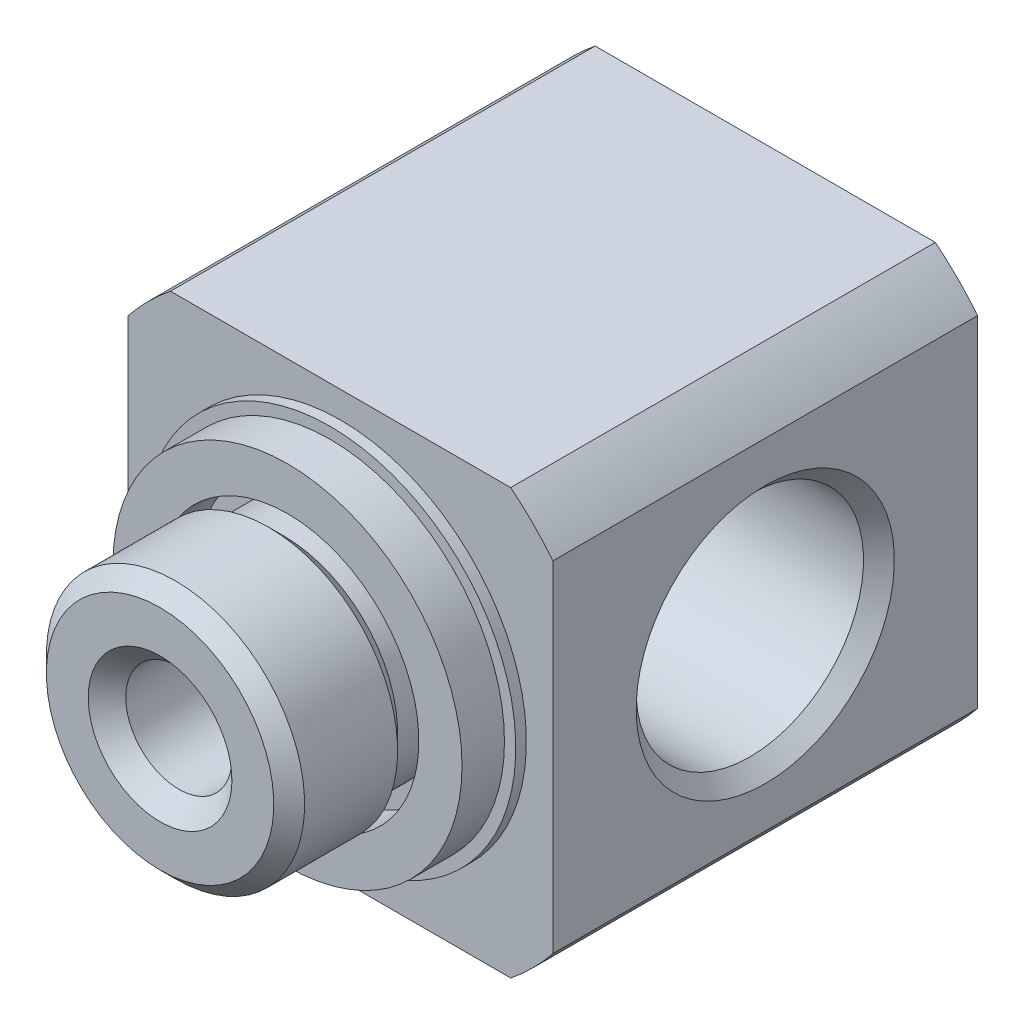
ISO-10303-21;
HEADER;
FILE_DESCRIPTION(('STEP AP214'),'2;1');
FILE_NAME('part.step','',(''),(''),'','','');
FILE_SCHEMA(('AUTOMOTIVE_DESIGN { 1 0 10303 214 1 1 1 1 }'));
ENDSEC;
DATA;
#1=APPLICATION_CONTEXT('core data for automotive mechanical design processes');
#2=APPLICATION_PROTOCOL_DEFINITION('international standard','automotive_design',2000,#1);
#3=PRODUCT_CONTEXT('',#1,'mechanical');
#4=PRODUCT('Part','Part','',(#3));
#5=PRODUCT_RELATED_PRODUCT_CATEGORY('part','',(#4));
#6=PRODUCT_DEFINITION_FORMATION('','',#4);
#7=PRODUCT_DEFINITION_CONTEXT('part definition',#1,'design');
#8=PRODUCT_DEFINITION('design','',#6,#7);
#9=PRODUCT_DEFINITION_SHAPE('','',#8);
#10=(LENGTH_UNIT() NAMED_UNIT(*) SI_UNIT(.MILLI.,.METRE.));
#11=(NAMED_UNIT(*) PLANE_ANGLE_UNIT() SI_UNIT($,.RADIAN.));
#12=(NAMED_UNIT(*) SI_UNIT($,.STERADIAN.) SOLID_ANGLE_UNIT());
#13=UNCERTAINTY_MEASURE_WITH_UNIT(LENGTH_MEASURE(1.E-05),#10,'distance_accuracy_value','');
#14=(GEOMETRIC_REPRESENTATION_CONTEXT(3) GLOBAL_UNCERTAINTY_ASSIGNED_CONTEXT((#13)) GLOBAL_UNIT_ASSIGNED_CONTEXT((#10,
#11,#12)) REPRESENTATION_CONTEXT('',''));
#15=CARTESIAN_POINT('',(0.,0.,0.));
#16=DIRECTION('',(0.,0.,1.));
#17=DIRECTION('',(1.,0.,0.));
#18=AXIS2_PLACEMENT_3D('',#15,#16,#17);
#19=CARTESIAN_POINT('',(0.,0.,14.4464466094065));
#20=DIRECTION('',(0.,0.,1.));
#21=DIRECTION('',(0.,1.,0.));
#22=AXIS2_PLACEMENT_3D('',#19,#20,#21);
#23=CONICAL_SURFACE('',#22,2.35355339059325,0.785398163397094);
#24=CARTESIAN_POINT('',(0.,0.,14.092893218813));
#25=DIRECTION('',(0.,0.,-1.));
#26=DIRECTION('',(0.,1.,0.));
#27=AXIS2_PLACEMENT_3D('',#24,#25,#26);
#28=CIRCLE('',#27,2.);
#29=CARTESIAN_POINT('',(0.,2.,14.092893218813));
#30=VERTEX_POINT('',#29);
#31=EDGE_CURVE('E11',#30,#30,#28,.T.);
#32=ORIENTED_EDGE('',*,*,#31,.T.);
#33=EDGE_LOOP('',(#32));
#34=FACE_BOUND('',#33,.T.);
#35=CARTESIAN_POINT('',(0.,0.,14.8));
#36=DIRECTION('',(0.,0.,-1.));
#37=DIRECTION('',(0.,1.,0.));
#38=AXIS2_PLACEMENT_3D('',#35,#36,#37);
#39=CIRCLE('',#38,2.7071067811865);
#40=CARTESIAN_POINT('',(0.,2.7071067811865,14.8));
#41=VERTEX_POINT('',#40);
#42=EDGE_CURVE('E219',#41,#41,#39,.T.);
#43=ORIENTED_EDGE('',*,*,#42,.F.);
#44=EDGE_LOOP('',(#43));
#45=FACE_BOUND('',#44,.T.);
#46=ADVANCED_FACE('F17',(#34,#45),#23,.F.);
#47=CARTESIAN_POINT('',(0.,0.,7.0464466094065));
#48=DIRECTION('',(0.,0.,1.));
#49=DIRECTION('',(0.,1.,0.));
#50=AXIS2_PLACEMENT_3D('',#47,#48,#49);
#51=CYLINDRICAL_SURFACE('',#50,2.);
#52=CARTESIAN_POINT('',(0.,1.99999999999998,3.7873591062903));
#53=CARTESIAN_POINT('',(-0.0322225855098003,1.99999403364435,3.78736092510232));
#54=CARTESIAN_POINT('',(-0.0644422320749665,1.99917434592477,3.78779508123807));
#55=CARTESIAN_POINT('',(-0.129016025779688,1.99593642093506,3.78950298601541));
#56=CARTESIAN_POINT('',(-0.161369429495311,1.9935065188562,3.79078286106949));
#57=CARTESIAN_POINT('',(-0.226210045204364,1.98704499811597,3.79417367185201));
#58=CARTESIAN_POINT('',(-0.258695177085984,1.98299706415656,3.79629307082892));
#59=CARTESIAN_POINT('',(-0.323800769252444,1.97329680874096,3.80134437764246));
#60=CARTESIAN_POINT('',(-0.356417358594832,1.96762402076201,3.80428663824022));
#61=CARTESIAN_POINT('',(-0.421764370636746,1.9546716523135,3.81095811618483));
#62=CARTESIAN_POINT('',(-0.454489104394777,1.94736915071734,3.81469852237619));
#63=CARTESIAN_POINT('',(-0.519311965820555,1.93122399576629,3.82289738251743));
#64=CARTESIAN_POINT('',(-0.551412204779927,1.92238820274711,3.82735263165357));
#65=CARTESIAN_POINT('',(-0.614986925605875,1.90316636846849,3.83694695949968));
#66=CARTESIAN_POINT('',(-0.646462286051339,1.89278270875671,3.84208498639221));
#67=CARTESIAN_POINT('',(-0.708787224736917,1.87044898439008,3.85300716534164));
#68=CARTESIAN_POINT('',(-0.739635899222135,1.85849682058247,3.85879218171328));
#69=CARTESIAN_POINT('',(-0.800209154483072,1.83323404097384,3.87085718159939));
#70=CARTESIAN_POINT('',(-0.829942922922191,1.81994207183468,3.87713015186951));
#71=CARTESIAN_POINT('',(-0.888918031479625,1.79180501534373,3.89021424641479));
#72=CARTESIAN_POINT('',(-0.918151643008258,1.7769459273923,3.89703006032079));
#73=CARTESIAN_POINT('',(-0.97612746450053,1.74565342387358,3.91114833496912));
#74=CARTESIAN_POINT('',(-1.00485923479123,1.7292029194103,3.91845574309702));
#75=CARTESIAN_POINT('',(-1.06183403248451,1.69470812544723,3.9334987413001));
#76=CARTESIAN_POINT('',(-1.09006388231405,1.67664414264907,3.94123901178485));
#77=CARTESIAN_POINT('',(-1.14447456335615,1.63995822876015,3.95664078756353));
#78=CARTESIAN_POINT('',(-1.17069223458948,1.62138705442172,3.96429318395117));
#79=CARTESIAN_POINT('',(-1.22205917602023,1.58314484193879,3.97971911071421));
#80=CARTESIAN_POINT('',(-1.24721317882251,1.56347984100633,3.98749183277592));
#81=CARTESIAN_POINT('',(-1.29645323034605,1.52303896086674,4.00311250545927));
#82=CARTESIAN_POINT('',(-1.32054227076988,1.50226661035633,4.0109601585475));
#83=CARTESIAN_POINT('',(-1.36765546993925,1.45960217598261,4.02668186464589));
#84=CARTESIAN_POINT('',(-1.39068060039993,1.43771115394691,4.03455588622783));
#85=CARTESIAN_POINT('',(-1.43550789962862,1.3929527439227,4.05022598572905));
#86=CARTESIAN_POINT('',(-1.45731636952698,1.37009173278672,4.05802225108173));
#87=CARTESIAN_POINT('',(-1.49991400772751,1.32321281945393,4.07354995859606));
#88=CARTESIAN_POINT('',(-1.52069799415807,1.29919005479179,4.08128093405954));
#89=CARTESIAN_POINT('',(-1.56124987147542,1.24998025893602,4.09662140948093));
#90=CARTESIAN_POINT('',(-1.58101009575827,1.22478655396121,4.10422976140092));
#91=CARTESIAN_POINT('',(-1.61951757329443,1.17322865771359,4.11926579069395));
#92=CARTESIAN_POINT('',(-1.63825467573696,1.14685627569474,4.12669135666509));
#93=CARTESIAN_POINT('',(-1.675099923307,1.09236234571076,4.14145576126441));
#94=CARTESIAN_POINT('',(-1.69316938449214,1.06421185409779,4.14878441414128));
#95=CARTESIAN_POINT('',(-1.72774321142416,1.00729821202314,4.16296643387457));
#96=CARTESIAN_POINT('',(-1.74426281513489,0.978545428339325,4.16982419806542));
#97=CARTESIAN_POINT('',(-1.77573959196767,0.920435902697168,4.18303315614326));
#98=CARTESIAN_POINT('',(-1.79070965147881,0.891087070206717,4.18938840289748));
#99=CARTESIAN_POINT('',(-1.81909125224259,0.831795185189944,4.20156105345401));
#100=CARTESIAN_POINT('',(-1.83251290900633,0.801857685236834,4.20738189058738));
#101=CARTESIAN_POINT('',(-1.85792153494963,0.741091930635584,4.21851049590289));
#102=CARTESIAN_POINT('',(-1.86990043203856,0.710259762874307,4.22381534805687));
#103=CARTESIAN_POINT('',(-1.89231842284073,0.647900355639973,4.23382954245299));
#104=CARTESIAN_POINT('',(-1.90275553562844,0.616372280777481,4.23853811749323));
#105=CARTESIAN_POINT('',(-1.92209553498119,0.552633092126617,4.24731967367976));
#106=CARTESIAN_POINT('',(-1.93099263515207,0.520419891973284,4.25139025245034));
#107=CARTESIAN_POINT('',(-1.94725578605456,0.455323152085297,4.25885542849658));
#108=CARTESIAN_POINT('',(-1.95461226776269,0.422436739220042,4.26224579571278));
#109=CARTESIAN_POINT('',(-1.96760857689001,0.356964873072775,4.26822251431359));
#110=CARTESIAN_POINT('',(-1.97328069399219,0.324387211834634,4.27082401243525));
#111=CARTESIAN_POINT('',(-1.98298897907824,0.259294485557998,4.27526701224005));
#112=CARTESIAN_POINT('',(-1.98704200350635,0.226782481054934,4.27711634859265));
#113=CARTESIAN_POINT('',(-1.99351484126871,0.161840424273486,4.28006357904881));
#114=CARTESIAN_POINT('',(-1.99594819242668,0.129412008890235,4.28116770302883));
#115=CARTESIAN_POINT('',(-1.99918562131711,0.0646553366082341,4.28263366699753));
#116=CARTESIAN_POINT('',(-1.99999956084848,0.032327677951142,4.28300000011079));
#117=CARTESIAN_POINT('',(-2.00000043898965,-0.0323157615863603,4.28299999988925));
#118=CARTESIAN_POINT('',(-1.99918797722065,-0.0646315424525492,4.28263393657418));
#119=CARTESIAN_POINT('',(-1.9959525190497,-0.129372404928959,4.28116887009348));
#120=CARTESIAN_POINT('',(-1.99351925817674,-0.161796864247999,4.28006519550878));
#121=CARTESIAN_POINT('',(-1.98704622989354,-0.226738936148108,4.277118687808));
#122=CARTESIAN_POINT('',(-1.98299253679569,-0.259254864586438,4.2752694462155));
#123=CARTESIAN_POINT('',(-1.97328304944997,-0.324363491184723,4.27082590465863));
#124=CARTESIAN_POINT('',(-1.96761003621734,-0.356953062817656,4.26822359259921));
#125=CARTESIAN_POINT('',(-1.95461550403955,-0.42242498496107,4.2622468685534));
#126=CARTESIAN_POINT('',(-1.94726280978687,-0.455299813814699,4.25885783256481));
#127=CARTESIAN_POINT('',(-1.93100470659119,-0.52038118468091,4.2513949618118));
#128=CARTESIAN_POINT('',(-1.92210849157274,-0.552590486439022,4.2473251867325));
#129=CARTESIAN_POINT('',(-1.90276830678654,-0.616329715053992,4.2385443370479));
#130=CARTESIAN_POINT('',(-1.89232974084554,-0.647861590480797,4.23383550597249));
#131=CARTESIAN_POINT('',(-1.86990745179457,-0.710236638346927,4.22381932275126));
#132=CARTESIAN_POINT('',(-1.85792533090775,-0.741080486553632,4.21851259193683));
#133=CARTESIAN_POINT('',(-1.83251842418582,-0.801846847023643,4.20738387532119));
#134=CARTESIAN_POINT('',(-1.81910281842554,-0.831773809023054,4.20156520593448));
#135=CARTESIAN_POINT('',(-1.79072927970253,-0.891051747406256,4.18939589220458));
#136=CARTESIAN_POINT('',(-1.7757608671432,-0.920396972698579,4.1830416959296));
#137=CARTESIAN_POINT('',(-1.74428392255959,-0.978506548801328,4.16983334775935));
#138=CARTESIAN_POINT('',(-1.72776216202652,-1.00726277972039,4.16297503537646));
#139=CARTESIAN_POINT('',(-1.69318094597919,-1.06419077924158,4.14878989579861));
#140=CARTESIAN_POINT('',(-1.67510593904516,-1.09235196645704,4.14145857349148));
#141=CARTESIAN_POINT('',(-1.63826190768291,-1.14684701518527,4.12669386557365));
#142=CARTESIAN_POINT('',(-1.61953246218594,-1.17321048780317,4.11927090254762));
#143=CARTESIAN_POINT('',(-1.58103518155665,-1.22475660861311,4.10423867987357));
#144=CARTESIAN_POINT('',(-1.56127721882889,-1.24994722133677,4.09663146948472));
#145=CARTESIAN_POINT('',(-1.52072520295743,-1.29915704783405,4.08129146067596));
#146=CARTESIAN_POINT('',(-1.49993853360974,-1.32318268948843,4.07355976785129));
#147=CARTESIAN_POINT('',(-1.45733125731623,-1.37007386642935,4.05802833873308));
#148=CARTESIAN_POINT('',(-1.43551555323514,-1.39294400286667,4.05022904605764));
#149=CARTESIAN_POINT('',(-1.39068943702066,-1.43770343569671,4.03455858836835));
#150=CARTESIAN_POINT('',(-1.36767352289931,-1.45958716439209,4.02668725948345));
#151=CARTESIAN_POINT('',(-1.32057260513717,-1.50224196829067,4.01096937597907));
#152=CARTESIAN_POINT('',(-1.29648637408358,-1.52301170246147,4.00312286146507));
#153=CARTESIAN_POINT('',(-1.24724620354649,-1.56345257286134,3.98750253849201));
#154=CARTESIAN_POINT('',(-1.22208903016501,-1.58311989452803,3.97972905168962));
#155=CARTESIAN_POINT('',(-1.17071028839282,-1.62137230316416,3.96429925695365));
#156=CARTESIAN_POINT('',(-1.14448376484849,-1.6399510685855,3.95664379356967));
#157=CARTESIAN_POINT('',(-1.09007440318431,-1.67663804407575,3.94124157217452));
#158=CARTESIAN_POINT('',(-1.06185538013024,-1.69469640410892,3.93350375899258));
#159=CARTESIAN_POINT('',(-1.00489500835319,-1.72918377374623,3.9184641849757));
#160=CARTESIAN_POINT('',(-0.976166627316667,-1.7456321607791,3.91115781536905));
#161=CARTESIAN_POINT('',(-0.918190706612207,-1.77692458970282,3.89703979868395));
#162=CARTESIAN_POINT('',(-0.888953395862731,-1.7917853765966,3.89022330367844));
#163=CARTESIAN_POINT('',(-0.829964271169157,-1.81993053371562,3.87713559144173));
#164=CARTESIAN_POINT('',(-0.80021998406888,-1.83322853919233,3.87085980910642));
#165=CARTESIAN_POINT('',(-0.739647429961084,-1.85849300834242,3.85879400239765));
#166=CARTESIAN_POINT('',(-0.708810518830788,-1.87044193077491,3.85301057511466));
#167=CARTESIAN_POINT('',(-0.64650124797178,-1.89277135639549,3.84209057790315));
#168=CARTESIAN_POINT('',(-0.615029630260217,-1.90315358290411,3.83695329828225));
#169=CARTESIAN_POINT('',(-0.551454845610009,-1.92237528870492,3.82735912051034));
#170=CARTESIAN_POINT('',(-0.519350659605447,-1.93121200535095,3.82290344248901));
#171=CARTESIAN_POINT('',(-0.454512385901127,-1.94736213911338,3.81470211217277));
#172=CARTESIAN_POINT('',(-0.421776071531658,-1.95466832145011,3.81095983928894));
#173=CARTESIAN_POINT('',(-0.35642323230969,-1.96762385262863,3.80428671750632));
#174=CARTESIAN_POINT('',(-0.323812601034265,-1.97329694297665,3.80134428012826));
#175=CARTESIAN_POINT('',(-0.258714823632213,-1.98299747363041,3.79629288485552));
#176=CARTESIAN_POINT('',(-0.226231519263893,-1.98704521542332,3.79417365630819));
#177=CARTESIAN_POINT('',(-0.161391092999434,-1.99350667454207,3.79078268187533));
#178=CARTESIAN_POINT('',(-0.129036023299079,-1.99593652067038,3.78950257286471));
#179=CARTESIAN_POINT('',(-0.0644535761229479,-1.99917443446046,3.78779539250165));
#180=CARTESIAN_POINT('',(-0.032226939751951,-1.99999397377069,3.78736228729226));
#181=CARTESIAN_POINT('',(0.0321546699044581,-2.00000601271532,3.78735593242181));
#182=CARTESIAN_POINT('',(0.0643096418307149,-1.99920215691199,3.7877807566878));
#183=CARTESIAN_POINT('',(0.12879663124019,-1.9959845704806,3.78947725744348));
#184=CARTESIAN_POINT('',(0.16112775139532,-1.99355687888126,3.79075627775838));
#185=CARTESIAN_POINT('',(0.225968274384174,-1.98709443034395,3.79414788482589));
#186=CARTESIAN_POINT('',(0.25847531577426,-1.98304114543479,3.79627007909727));
#187=CARTESIAN_POINT('',(0.323669154692354,-1.97332437898205,3.8013300577765));
#188=CARTESIAN_POINT('',(0.356351676457844,-1.96763830888551,3.80427926898271));
#189=CARTESIAN_POINT('',(0.421764066798443,-1.95467042669855,3.81095875736062));
#190=CARTESIAN_POINT('',(0.454489023151072,-1.94736882299772,3.81469869382146));
#191=CARTESIAN_POINT('',(0.519312046710353,-1.93122432205555,3.82289721182045));
#192=CARTESIAN_POINT('',(0.551412226439655,-1.92238829011559,3.82735258594708));
#193=CARTESIAN_POINT('',(0.614986903980024,-1.9031662812328,3.8369470051367));
#194=CARTESIAN_POINT('',(0.646462280255627,-1.89278268537634,3.84208499862355));
#195=CARTESIAN_POINT('',(0.708787230541115,-1.87044900780185,3.85300715309385));
#196=CARTESIAN_POINT('',(0.739635900768951,-1.85849682682152,3.85879217844934));
#197=CARTESIAN_POINT('',(0.800209152959224,-1.83323403481043,3.87085718482369));
#198=CARTESIAN_POINT('',(0.829942922518279,-1.81994207017233,3.877130152739));
#199=CARTESIAN_POINT('',(0.888918031907379,-1.79180501701418,3.89021424554058));
#200=CARTESIAN_POINT('',(0.91815164313386,-1.77694592783833,3.89703006008707));
#201=CARTESIAN_POINT('',(0.976127464400829,-1.74565342341068,3.91114833521084));
#202=CARTESIAN_POINT('',(1.00485923477317,-1.72920291928206,3.91845574316369));
#203=CARTESIAN_POINT('',(1.06183403252297,-1.69470812556912,3.93349874123604));
#204=CARTESIAN_POINT('',(1.09006388232593,-1.67664414268036,3.94123901176832));
#205=CARTESIAN_POINT('',(1.1444745633481,-1.63995822872789,3.95664078758033));
#206=CARTESIAN_POINT('',(1.17069223458682,-1.62138705441173,3.96429318395622));
#207=CARTESIAN_POINT('',(1.22205917602136,-1.58314484194458,3.97971911071086));
#208=CARTESIAN_POINT('',(1.24721317882206,-1.56347984100577,3.98749183277585));
#209=CARTESIAN_POINT('',(1.29645323034448,-1.5230389608617,4.00311250546151));
#210=CARTESIAN_POINT('',(1.32054227076875,-1.50226661035314,4.01096015854878));
#211=CARTESIAN_POINT('',(1.3676554699388,-1.45960217598165,4.02668186464613));
#212=CARTESIAN_POINT('',(1.39068060039971,-1.43771115394635,4.034555886228));
#213=CARTESIAN_POINT('',(1.43550789962629,-1.39295274392584,4.05022598572798));
#214=CARTESIAN_POINT('',(1.45731636952244,-1.3700917327933,4.0580222510795));
#215=CARTESIAN_POINT('',(1.49991400772,-1.32321281946505,4.07354995859243));
#216=CARTESIAN_POINT('',(1.52069799414971,-1.29919005480393,4.08128093405567));
#217=CARTESIAN_POINT('',(1.56124987146703,-1.24998025894815,4.09662140947724));
#218=CARTESIAN_POINT('',(1.5810100957506,-1.22478655397223,4.10422976139764));
#219=CARTESIAN_POINT('',(1.61951757328988,-1.17322865772027,4.11926579069207));
#220=CARTESIAN_POINT('',(1.63825467573472,-1.14685627569811,4.12669135666418));
#221=CARTESIAN_POINT('',(1.67509992330685,-1.09236234571095,4.14145576126436));
#222=CARTESIAN_POINT('',(1.69316938449193,-1.06421185409824,4.14878441414116));
#223=CARTESIAN_POINT('',(1.72774321142386,-1.00729821202392,4.16296643387438));
#224=CARTESIAN_POINT('',(1.74426281513455,-0.978545428340174,4.16982419806522));
#225=CARTESIAN_POINT('',(1.77573959196731,-0.920435902698005,4.18303315614307));
#226=CARTESIAN_POINT('',(1.79070965147848,-0.891087070207472,4.18938840289732));
#227=CARTESIAN_POINT('',(1.8190912522424,-0.831795185190387,4.20156105345392));
#228=CARTESIAN_POINT('',(1.83251290900625,-0.801857685237042,4.20738189058734));
#229=CARTESIAN_POINT('',(1.85792153494916,-0.741091930636593,4.21851049590271));
#230=CARTESIAN_POINT('',(1.86990043203765,-0.710259762876382,4.22381534805651));
#231=CARTESIAN_POINT('',(1.89231842283924,-0.64790035564349,4.23382954245245));
#232=CARTESIAN_POINT('',(1.90275553562678,-0.616372280781358,4.23853811749266));
#233=CARTESIAN_POINT('',(1.92209553497951,-0.552633092130511,4.24731967367925));
#234=CARTESIAN_POINT('',(1.93099263515051,-0.520419891976823,4.25139025244991));
#235=CARTESIAN_POINT('',(1.94725578605363,-0.455323152087433,4.25885542849636));
#236=CARTESIAN_POINT('',(1.95461226776226,-0.422436739221118,4.26224579571268));
#237=CARTESIAN_POINT('',(1.96760857689,-0.356964873073916,4.26822251431348));
#238=CARTESIAN_POINT('',(1.97328069399223,-0.324387211836924,4.27082401243506));
#239=CARTESIAN_POINT('',(1.98298897907832,-0.25929448556182,4.27526701223981));
#240=CARTESIAN_POINT('',(1.98704200350639,-0.226782481059133,4.27711634859242));
#241=CARTESIAN_POINT('',(1.99351484126875,-0.161840424277686,4.28006357904865));
#242=CARTESIAN_POINT('',(1.9959481924267,-0.129412008894055,4.28116770302872));
#243=CARTESIAN_POINT('',(1.99918562131714,-0.0646553366105285,4.2826336669975));
#244=CARTESIAN_POINT('',(1.99999956084848,-0.03232767795229,4.28300000011079));
#245=CARTESIAN_POINT('',(2.00000043898964,0.0323157615873492,4.28299999988925));
#246=CARTESIAN_POINT('',(1.99918797722067,0.0646315424545285,4.28263393657416));
#247=CARTESIAN_POINT('',(1.99595251904972,0.129372404932258,4.28116887009338));
#248=CARTESIAN_POINT('',(1.99351925817676,0.161796864251629,4.28006519550864));
#249=CARTESIAN_POINT('',(1.98704622989357,0.226738936151742,4.27711868780781));
#250=CARTESIAN_POINT('',(1.98299253679576,0.259254864589748,4.27526944621529));
#251=CARTESIAN_POINT('',(1.97328304945,0.32436349118671,4.27082590465848));
#252=CARTESIAN_POINT('',(1.96761003621734,0.35695306281865,4.26822359259912));
#253=CARTESIAN_POINT('',(1.95461550403927,0.422424984961488,4.26224686855337));
#254=CARTESIAN_POINT('',(1.94726280978627,0.455299813815517,4.25885783256472));
#255=CARTESIAN_POINT('',(1.93100470659018,0.520381184682266,4.25139496181163));
#256=CARTESIAN_POINT('',(1.92210849157166,0.552590486440518,4.24732518673231));
#257=CARTESIAN_POINT('',(1.90276830678546,0.616329715055489,4.23854433704768));
#258=CARTESIAN_POINT('',(1.89232974084456,0.647861590482161,4.23383550597228));
#259=CARTESIAN_POINT('',(1.86990745179398,0.710236638347757,4.22381932275112));
#260=CARTESIAN_POINT('',(1.85792533090746,0.741080486554069,4.21851259193675));
#261=CARTESIAN_POINT('',(1.83251842418614,0.801846847023233,4.20738387532126));
#262=CARTESIAN_POINT('',(1.81910281842617,0.831773809022193,4.20156520593465));
#263=CARTESIAN_POINT('',(1.79072927970355,0.891051747404795,4.18939589220489));
#264=CARTESIAN_POINT('',(1.77576086714432,0.92039697269696,4.18304169592996));
#265=CARTESIAN_POINT('',(1.74428392256071,0.978506548799712,4.16983334775973));
#266=CARTESIAN_POINT('',(1.72776216202754,1.00726277971892,4.16297503537682));
#267=CARTESIAN_POINT('',(1.69318094597978,1.06419077924069,4.14878989579884));
#268=CARTESIAN_POINT('',(1.67510593904541,1.09235196645657,4.14145857349161));
#269=CARTESIAN_POINT('',(1.63826190768083,1.14684701518844,4.12669386557279));
#270=CARTESIAN_POINT('',(1.61953246218176,1.17321048780948,4.11927090254585));
#271=CARTESIAN_POINT('',(1.5810351815496,1.22475660862352,4.10423867987048));
#272=CARTESIAN_POINT('',(1.56127721882117,1.24994722134821,4.09663146948123));
#273=CARTESIAN_POINT('',(1.52072520294975,1.29915704784551,4.08129146067231));
#274=CARTESIAN_POINT('',(1.49993853360285,1.32318268949893,4.07355976784787));
#275=CARTESIAN_POINT('',(1.45733125731204,1.37007386643553,4.05802833873099));
#276=CARTESIAN_POINT('',(1.43551555323294,1.39294400286956,4.05022904605666));
#277=CARTESIAN_POINT('',(1.39068943701761,1.43770343569903,4.03455858836751));
#278=CARTESIAN_POINT('',(1.36767352289316,1.45958716439688,4.02668725948164));
#279=CARTESIAN_POINT('',(1.3205726051265,1.50224196829701,4.01096937597678));
#280=CARTESIAN_POINT('',(1.29648637407156,1.52301170246697,4.00312286146326));
#281=CARTESIAN_POINT('',(1.24724620353556,1.5634525728712,3.98750253848788));
#282=CARTESIAN_POINT('',(1.22208903015659,1.58311989454322,3.97972905168265));
#283=CARTESIAN_POINT('',(1.17071028838459,1.62137230316006,3.96429925695616));
#284=CARTESIAN_POINT('',(1.14448376483798,1.63995106855671,3.95664379358455));
#285=CARTESIAN_POINT('',(1.09007440319201,1.67663804410784,3.94124157215813));
#286=CARTESIAN_POINT('',(1.06185538015938,1.69469640423086,3.9335037589303));
#287=CARTESIAN_POINT('',(1.00489500832447,1.72918377362601,3.9184641850371));
#288=CARTESIAN_POINT('',(0.976166627210066,1.7456321603328,3.91115781559698));
#289=CARTESIAN_POINT('',(0.918190706717542,1.77692459014383,3.89703979845873));
#290=CARTESIAN_POINT('',(0.88895339625352,1.79178537823275,3.89022330284285));
#291=CARTESIAN_POINT('',(0.829964270782078,1.81993053209502,3.87713559226938));
#292=CARTESIAN_POINT('',(0.800219982631267,1.83322853317337,3.87085981218033));
#293=CARTESIAN_POINT('',(0.739647431415625,1.85849301443233,3.85879399928751));
#294=CARTESIAN_POINT('',(0.708810524287017,1.87044195361907,3.85301056344808));
#295=CARTESIAN_POINT('',(0.646501242521525,1.89277133357668,3.84209058955679));
#296=CARTESIAN_POINT('',(0.615029609922742,1.90315349775578,3.83695334176775));
#297=CARTESIAN_POINT('',(0.551454865983376,1.92237537400396,3.82735907694786));
#298=CARTESIAN_POINT('',(0.519350735701657,1.93121232394932,3.82290327977987));
#299=CARTESIAN_POINT('',(0.454512309452877,1.9473618190414,3.81470227563449));
#300=CARTESIAN_POINT('',(0.421775785593876,1.95466712429125,3.81096045068155));
#301=CARTESIAN_POINT('',(0.356357531826413,1.96763811415884,3.80427937686061));
#302=CARTESIAN_POINT('',(0.323680919248794,1.97332441119194,3.80133006810005));
#303=CARTESIAN_POINT('',(0.258495027417217,1.98304167359392,3.79626977734898));
#304=CARTESIAN_POINT('',(0.225989991999423,1.98709505896209,3.7941474550682));
#305=CARTESIAN_POINT('',(0.161149172072539,1.99355665332889,3.79075649483346));
#306=CARTESIAN_POINT('',(0.128815730210423,1.99598321958414,3.78947833378063));
#307=CARTESIAN_POINT('',(0.0643218755906507,1.99920370201126,3.78777958105488));
#308=CARTESIAN_POINT('',(0.032162333200032,2.00001134158929,3.78735178125469));
#309=CARTESIAN_POINT('',(0.,1.99999999999998,3.7873591062903));
#310=B_SPLINE_CURVE_WITH_KNOTS('',3,(#52,#53,#54,#55,#56,#57,#58,#59,#60,#61,#62,#63,#64,#65,
#66,#67,#68,#69,#70,#71,#72,#73,#74,#75,#76,#77,#78,#79,#80,#81,#82,#83,#84,#85,#86,#87,#88,#89,
#90,#91,#92,#93,#94,#95,#96,#97,#98,#99,#100,#101,#102,#103,#104,#105,#106,#107,#108,#109,#110,
#111,#112,#113,#114,#115,#116,#117,#118,#119,#120,#121,#122,#123,#124,#125,#126,#127,#128,#129,
#130,#131,#132,#133,#134,#135,#136,#137,#138,#139,#140,#141,#142,#143,#144,#145,#146,#147,#148,
#149,#150,#151,#152,#153,#154,#155,#156,#157,#158,#159,#160,#161,#162,#163,#164,#165,#166,#167,
#168,#169,#170,#171,#172,#173,#174,#175,#176,#177,#178,#179,#180,#181,#182,#183,#184,#185,#186,
#187,#188,#189,#190,#191,#192,#193,#194,#195,#196,#197,#198,#199,#200,#201,#202,#203,#204,#205,
#206,#207,#208,#209,#210,#211,#212,#213,#214,#215,#216,#217,#218,#219,#220,#221,#222,#223,#224,
#225,#226,#227,#228,#229,#230,#231,#232,#233,#234,#235,#236,#237,#238,#239,#240,#241,#242,#243,
#244,#245,#246,#247,#248,#249,#250,#251,#252,#253,#254,#255,#256,#257,#258,#259,#260,#261,#262,
#263,#264,#265,#266,#267,#268,#269,#270,#271,#272,#273,#274,#275,#276,#277,#278,#279,#280,#281,
#282,#283,#284,#285,#286,#287,#288,#289,#290,#291,#292,#293,#294,#295,#296,#297,#298,#299,#300,
#301,#302,#303,#304,#305,#306,#307,#308,#309),.UNSPECIFIED.,.F.,.F.,(4,2,2,2,2,2,2,2,2,2,2,2,2,
2,2,2,2,2,2,2,2,2,2,2,2,2,2,2,2,2,2,2,2,2,2,2,2,2,2,2,2,2,2,2,2,2,2,2,2,2,2,2,2,2,2,2,2,2,2,2,2,
2,2,2,2,2,2,2,2,2,2,2,2,2,2,2,2,2,2,2,2,2,2,2,2,2,2,2,2,2,2,2,2,2,2,2,2,2,2,2,2,2,2,2,2,2,2,2,2,
2,2,2,2,2,2,2,2,2,2,2,2,2,2,2,2,2,2,2,4),(0.,0.0966506569396824,0.194009244250611,
0.292375356675037,0.392039502405056,0.493205245422292,0.593929498552982,0.69450034706809,
0.795207190488724,0.894667454548794,0.995106786457734,1.0967792542191,1.19992981100304,
1.29897826675452,1.39752581327425,1.49577618768737,1.59393497640238,1.69152623859503,
1.78956894868535,1.88826291821206,1.98780403547873,2.09049607146482,2.19204012173749,
2.29265720202063,2.39257447942939,2.49302709610421,2.5936076749157,2.69455833394995,
2.79611854424091,2.89558313610949,2.99398337873741,3.09155046732496,3.18852155639127,
3.28545690076622,3.38301204540951,3.48142423181021,3.58092457123623,3.68244816614131,
3.78338659185481,3.88397940331545,3.98446862748866,4.08434904526419,4.18495380965794,
4.28651017713084,4.3892390890664,4.48874424844228,4.58742620779752,4.6854809286277,
4.78310815100459,4.88123090392731,4.97946924198842,5.07802882406346,5.1771133098605,
5.28022667980193,5.38188672466831,5.48233847717789,5.58183590084624,5.68250602933331,
5.78306460348305,5.88380113174539,5.985003597609,6.0846504427051,6.1830107361422,
6.28037517840909,6.37704345557415,6.47349495132274,6.57078653629709,6.66922005000511,
6.76908697735107,6.8702527203687,6.97097697349952,7.0715478220145,7.17225466543475,
7.27171492950707,7.37215426142008,7.47382672917738,7.57697728594924,7.67602574170159,
7.77457328822164,7.8728236626344,7.97098245134826,8.0685737135286,8.1666164236148,
8.26531039314566,8.36485151042477,8.46754354641009,8.56908759668251,8.66970467696593,
8.76962195437547,8.87007457104679,8.9706551498571,9.07160580889249,9.17316601918689,
9.27263061105209,9.37103085367887,9.46859794226756,9.56556903133731,9.66250437571523,
9.76005952035951,9.85847170675923,9.95797204618232,10.0594956410888,10.1604340668028,
10.2610268782629,10.3615161024347,10.4613965202086,10.5620012846018,10.6635576520752,
10.7662865640124,10.8657917234,10.9644736827591,11.0625284035854,11.1601556259508,
11.2582783788849,11.3565167169498,11.455076299021,11.5541607848065,11.657274154748,
11.7589341996143,11.8593859521239,11.9588833757923,12.0595535042794,12.1601120784291,
12.2608486066915,12.362051072555,12.4619007024062,12.5603283979703,12.6576258373429,
12.7540949523041),.UNSPECIFIED.);
#311=CARTESIAN_POINT('',(0.,2.,3.7873591062903));
#312=VERTEX_POINT('',#311);
#313=EDGE_CURVE('E228',#312,#312,#310,.T.);
#314=ORIENTED_EDGE('',*,*,#313,.F.);
#315=EDGE_LOOP('',(#314));
#316=FACE_BOUND('',#315,.T.);
#317=ORIENTED_EDGE('',*,*,#31,.F.);
#318=EDGE_LOOP('',(#317));
#319=FACE_BOUND('',#318,.T.);
#320=ADVANCED_FACE('F276',(#316,#319),#51,.F.);
#321=CARTESIAN_POINT('',(-7.7095,0.,0.));
#322=DIRECTION('',(-1.,0.,0.));
#323=DIRECTION('',(0.,1.,0.));
#324=AXIS2_PLACEMENT_3D('',#321,#322,#323);
#325=CONICAL_SURFACE('',#324,4.5735,0.785398163397448);
#326=CARTESIAN_POINT('',(-7.419,0.,0.));
#327=DIRECTION('',(1.,0.,0.));
#328=DIRECTION('',(0.,1.,0.));
#329=AXIS2_PLACEMENT_3D('',#326,#327,#328);
#330=CIRCLE('',#329,4.283);
#331=CARTESIAN_POINT('',(-7.419,4.283,0.));
#332=VERTEX_POINT('',#331);
#333=EDGE_CURVE('E30',#332,#332,#330,.T.);
#334=ORIENTED_EDGE('',*,*,#333,.T.);
#335=EDGE_LOOP('',(#334));
#336=FACE_BOUND('',#335,.T.);
#337=CARTESIAN_POINT('',(-8.,0.,0.));
#338=DIRECTION('',(1.,0.,0.));
#339=DIRECTION('',(0.,1.,0.));
#340=AXIS2_PLACEMENT_3D('',#337,#338,#339);
#341=CIRCLE('',#340,4.864);
#342=CARTESIAN_POINT('',(-8.,4.864,0.));
#343=VERTEX_POINT('',#342);
#344=EDGE_CURVE('E182',#343,#343,#341,.T.);
#345=ORIENTED_EDGE('',*,*,#344,.F.);
#346=EDGE_LOOP('',(#345));
#347=FACE_BOUND('',#346,.T.);
#348=ADVANCED_FACE('F263',(#336,#347),#325,.F.);
#349=CARTESIAN_POINT('',(0.,0.,0.));
#350=DIRECTION('',(-1.,0.,0.));
#351=DIRECTION('',(0.,1.,0.));
#352=AXIS2_PLACEMENT_3D('',#349,#350,#351);
#353=CYLINDRICAL_SURFACE('',#352,4.283);
#354=ORIENTED_EDGE('',*,*,#313,.T.);
#355=EDGE_LOOP('',(#354));
#356=FACE_BOUND('',#355,.T.);
#357=CARTESIAN_POINT('',(7.419,0.,0.));
#358=DIRECTION('',(1.,0.,0.));
#359=DIRECTION('',(0.,1.,0.));
#360=AXIS2_PLACEMENT_3D('',#357,#358,#359);
#361=CIRCLE('',#360,4.283);
#362=CARTESIAN_POINT('',(7.419,4.283,0.));
#363=VERTEX_POINT('',#362);
#364=EDGE_CURVE('E323',#363,#363,#361,.T.);
#365=ORIENTED_EDGE('',*,*,#364,.T.);
#366=EDGE_LOOP('',(#365));
#367=FACE_BOUND('',#366,.T.);
#368=ORIENTED_EDGE('',*,*,#333,.F.);
#369=EDGE_LOOP('',(#368));
#370=FACE_BOUND('',#369,.T.);
#371=ADVANCED_FACE('F252',(#356,#367,#370),#353,.F.);
#372=CARTESIAN_POINT('',(7.7095,0.,0.));
#373=DIRECTION('',(1.,0.,0.));
#374=DIRECTION('',(0.,1.,0.));
#375=AXIS2_PLACEMENT_3D('',#372,#373,#374);
#376=CONICAL_SURFACE('',#375,4.5735,0.785398163397448);
#377=CARTESIAN_POINT('',(8.,0.,0.));
#378=DIRECTION('',(-1.,0.,0.));
#379=DIRECTION('',(0.,1.,0.));
#380=AXIS2_PLACEMENT_3D('',#377,#378,#379);
#381=CIRCLE('',#380,4.864);
#382=CARTESIAN_POINT('',(8.,4.864,0.));
#383=VERTEX_POINT('',#382);
#384=EDGE_CURVE('E216',#383,#383,#381,.T.);
#385=ORIENTED_EDGE('',*,*,#384,.F.);
#386=EDGE_LOOP('',(#385));
#387=FACE_BOUND('',#386,.T.);
#388=ORIENTED_EDGE('',*,*,#364,.F.);
#389=EDGE_LOOP('',(#388));
#390=FACE_BOUND('',#389,.T.);
#391=ADVANCED_FACE('F262',(#387,#390),#376,.F.);
#392=CARTESIAN_POINT('',(0.,0.,14.5095));
#393=DIRECTION('',(0.,0.,-1.));
#394=DIRECTION('',(0.,1.,0.));
#395=AXIS2_PLACEMENT_3D('',#392,#393,#394);
#396=CONICAL_SURFACE('',#395,4.5735,0.785398163397446);
#397=CARTESIAN_POINT('',(0.,0.,14.219));
#398=DIRECTION('',(0.,0.,-1.));
#399=DIRECTION('',(0.,1.,0.));
#400=AXIS2_PLACEMENT_3D('',#397,#398,#399);
#401=CIRCLE('',#400,4.864);
#402=CARTESIAN_POINT('',(0.,4.864,14.219));
#403=VERTEX_POINT('',#402);
#404=EDGE_CURVE('E229',#403,#403,#401,.T.);
#405=ORIENTED_EDGE('',*,*,#404,.F.);
#406=EDGE_LOOP('',(#405));
#407=FACE_BOUND('',#406,.T.);
#408=CARTESIAN_POINT('',(0.,0.,14.8));
#409=DIRECTION('',(0.,0.,-1.));
#410=DIRECTION('',(0.,1.,0.));
#411=AXIS2_PLACEMENT_3D('',#408,#409,#410);
#412=CIRCLE('',#411,4.283);
#413=CARTESIAN_POINT('',(0.,4.283,14.8));
#414=VERTEX_POINT('',#413);
#415=EDGE_CURVE('E120',#414,#414,#412,.T.);
#416=ORIENTED_EDGE('',*,*,#415,.T.);
#417=EDGE_LOOP('',(#416));
#418=FACE_BOUND('',#417,.T.);
#419=ADVANCED_FACE('F274',(#407,#418),#396,.T.);
#420=CARTESIAN_POINT('',(0.,0.,12.4666666666665));
#421=DIRECTION('',(0.,0.,1.));
#422=DIRECTION('',(0.,1.,0.));
#423=AXIS2_PLACEMENT_3D('',#420,#421,#422);
#424=CYLINDRICAL_SURFACE('',#423,4.864);
#425=CARTESIAN_POINT('',(0.,0.,10.714333333333));
#426=DIRECTION('',(0.,0.,-1.));
#427=DIRECTION('',(0.,1.,0.));
#428=AXIS2_PLACEMENT_3D('',#425,#426,#427);
#429=CIRCLE('',#428,4.864);
#430=CARTESIAN_POINT('',(0.,4.864,10.714333333333));
#431=VERTEX_POINT('',#430);
#432=EDGE_CURVE('E125',#431,#431,#429,.T.);
#433=ORIENTED_EDGE('',*,*,#432,.F.);
#434=EDGE_LOOP('',(#433));
#435=FACE_BOUND('',#434,.T.);
#436=ORIENTED_EDGE('',*,*,#404,.T.);
#437=EDGE_LOOP('',(#436));
#438=FACE_BOUND('',#437,.T.);
#439=ADVANCED_FACE('F270',(#435,#438),#424,.T.);
#440=CARTESIAN_POINT('',(0.,0.,10.423833333333));
#441=DIRECTION('',(0.,0.,1.));
#442=DIRECTION('',(0.,1.,0.));
#443=AXIS2_PLACEMENT_3D('',#440,#441,#442);
#444=CONICAL_SURFACE('',#443,4.5735,0.785398163397448);
#445=CARTESIAN_POINT('',(0.,0.,10.133333333333));
#446=DIRECTION('',(0.,0.,-1.));
#447=DIRECTION('',(0.,1.,0.));
#448=AXIS2_PLACEMENT_3D('',#445,#446,#447);
#449=CIRCLE('',#448,4.283);
#450=CARTESIAN_POINT('',(0.,4.283,10.133333333333));
#451=VERTEX_POINT('',#450);
#452=EDGE_CURVE('E235',#451,#451,#449,.T.);
#453=ORIENTED_EDGE('',*,*,#452,.F.);
#454=EDGE_LOOP('',(#453));
#455=FACE_BOUND('',#454,.T.);
#456=ORIENTED_EDGE('',*,*,#432,.T.);
#457=EDGE_LOOP('',(#456));
#458=FACE_BOUND('',#457,.T.);
#459=ADVANCED_FACE('F273',(#455,#458),#444,.T.);
#460=CARTESIAN_POINT('',(0.,0.,9.2666666666665));
#461=DIRECTION('',(0.,0.,1.));
#462=DIRECTION('',(0.,1.,0.));
#463=AXIS2_PLACEMENT_3D('',#460,#461,#462);
#464=CYLINDRICAL_SURFACE('',#463,4.283);
#465=CARTESIAN_POINT('',(0.,0.,8.4));
#466=DIRECTION('',(0.,0.,-1.));
#467=DIRECTION('',(0.,1.,0.));
#468=AXIS2_PLACEMENT_3D('',#465,#466,#467);
#469=CIRCLE('',#468,4.283);
#470=CARTESIAN_POINT('',(0.,4.283,8.4));
#471=VERTEX_POINT('',#470);
#472=EDGE_CURVE('E321',#471,#471,#469,.T.);
#473=ORIENTED_EDGE('',*,*,#472,.F.);
#474=EDGE_LOOP('',(#473));
#475=FACE_BOUND('',#474,.T.);
#476=ORIENTED_EDGE('',*,*,#452,.T.);
#477=EDGE_LOOP('',(#476));
#478=FACE_BOUND('',#477,.T.);
#479=ADVANCED_FACE('F378',(#475,#478),#464,.T.);
#480=CARTESIAN_POINT('',(0.,4.6165,8.4));
#481=DIRECTION('',(0.,0.,1.));
#482=DIRECTION('',(1.,0.,0.));
#483=AXIS2_PLACEMENT_3D('',#480,#481,#482);
#484=PLANE('',#483);
#485=CARTESIAN_POINT('',(0.,0.,8.4));
#486=DIRECTION('',(0.,0.,-1.));
#487=DIRECTION('',(0.,1.,0.));
#488=AXIS2_PLACEMENT_3D('',#485,#486,#487);
#489=CIRCLE('',#488,4.95);
#490=CARTESIAN_POINT('',(0.,4.95,8.4));
#491=VERTEX_POINT('',#490);
#492=EDGE_CURVE('E213',#491,#491,#489,.T.);
#493=ORIENTED_EDGE('',*,*,#492,.F.);
#494=EDGE_LOOP('',(#493));
#495=FACE_BOUND('',#494,.T.);
#496=ORIENTED_EDGE('',*,*,#472,.T.);
#497=EDGE_LOOP('',(#496));
#498=FACE_BOUND('',#497,.T.);
#499=ADVANCED_FACE('F264',(#495,#498),#484,.T.);
#500=CARTESIAN_POINT('',(0.,0.,9.2));
#501=DIRECTION('',(0.,0.,1.));
#502=DIRECTION('',(0.,1.,0.));
#503=AXIS2_PLACEMENT_3D('',#500,#501,#502);
#504=CYLINDRICAL_SURFACE('',#503,4.95);
#505=CARTESIAN_POINT('',(0.,0.,10.));
#506=DIRECTION('',(0.,0.,-1.));
#507=DIRECTION('',(0.,1.,0.));
#508=AXIS2_PLACEMENT_3D('',#505,#506,#507);
#509=CIRCLE('',#508,4.95);
#510=CARTESIAN_POINT('',(0.,4.95,10.));
#511=VERTEX_POINT('',#510);
#512=EDGE_CURVE('E209',#511,#511,#509,.T.);
#513=ORIENTED_EDGE('',*,*,#512,.F.);
#514=EDGE_LOOP('',(#513));
#515=FACE_BOUND('',#514,.T.);
#516=ORIENTED_EDGE('',*,*,#492,.T.);
#517=EDGE_LOOP('',(#516));
#518=FACE_BOUND('',#517,.T.);
#519=ADVANCED_FACE('F396',(#515,#518),#504,.F.);
#520=CARTESIAN_POINT('',(0.,5.7625,10.));
#521=DIRECTION('',(0.,0.,1.));
#522=DIRECTION('',(1.,0.,0.));
#523=AXIS2_PLACEMENT_3D('',#520,#521,#522);
#524=PLANE('',#523);
#525=CARTESIAN_POINT('',(0.,0.,10.));
#526=DIRECTION('',(0.,0.,-1.));
#527=DIRECTION('',(0.,1.,0.));
#528=AXIS2_PLACEMENT_3D('',#525,#526,#527);
#529=CIRCLE('',#528,6.575);
#530=CARTESIAN_POINT('',(0.,6.575,10.));
#531=VERTEX_POINT('',#530);
#532=EDGE_CURVE('E195',#531,#531,#529,.T.);
#533=ORIENTED_EDGE('',*,*,#532,.F.);
#534=EDGE_LOOP('',(#533));
#535=FACE_BOUND('',#534,.T.);
#536=ORIENTED_EDGE('',*,*,#512,.T.);
#537=EDGE_LOOP('',(#536));
#538=FACE_BOUND('',#537,.T.);
#539=ADVANCED_FACE('F311',(#535,#538),#524,.T.);
#540=CARTESIAN_POINT('',(0.,0.,9.2));
#541=DIRECTION('',(0.,0.,1.));
#542=DIRECTION('',(0.,1.,0.));
#543=AXIS2_PLACEMENT_3D('',#540,#541,#542);
#544=CYLINDRICAL_SURFACE('',#543,6.575);
#545=CARTESIAN_POINT('',(0.,0.,8.4));
#546=DIRECTION('',(0.,0.,-1.));
#547=DIRECTION('',(0.,1.,0.));
#548=AXIS2_PLACEMENT_3D('',#545,#546,#547);
#549=CIRCLE('',#548,6.575);
#550=CARTESIAN_POINT('',(0.,6.575,8.4));
#551=VERTEX_POINT('',#550);
#552=EDGE_CURVE('E191',#551,#551,#549,.T.);
#553=ORIENTED_EDGE('',*,*,#552,.F.);
#554=EDGE_LOOP('',(#553));
#555=FACE_BOUND('',#554,.T.);
#556=ORIENTED_EDGE('',*,*,#532,.T.);
#557=EDGE_LOOP('',(#556));
#558=FACE_BOUND('',#557,.T.);
#559=ADVANCED_FACE('F19',(#555,#558),#544,.T.);
#560=CARTESIAN_POINT('',(0.,6.7875,8.4));
#561=DIRECTION('',(0.,0.,1.));
#562=DIRECTION('',(1.,0.,0.));
#563=AXIS2_PLACEMENT_3D('',#560,#561,#562);
#564=PLANE('',#563);
#565=CARTESIAN_POINT('',(0.,0.,8.4));
#566=DIRECTION('',(0.,0.,-1.));
#567=DIRECTION('',(0.,1.,0.));
#568=AXIS2_PLACEMENT_3D('',#565,#566,#567);
#569=CIRCLE('',#568,7.);
#570=CARTESIAN_POINT('',(0.,7.,8.4));
#571=VERTEX_POINT('',#570);
#572=EDGE_CURVE('E196',#571,#571,#569,.T.);
#573=ORIENTED_EDGE('',*,*,#572,.F.);
#574=EDGE_LOOP('',(#573));
#575=FACE_BOUND('',#574,.T.);
#576=ORIENTED_EDGE('',*,*,#552,.T.);
#577=EDGE_LOOP('',(#576));
#578=FACE_BOUND('',#577,.T.);
#579=ADVANCED_FACE('F302',(#575,#578),#564,.T.);
#580=CARTESIAN_POINT('',(0.,0.,8.2));
#581=DIRECTION('',(0.,0.,1.));
#582=DIRECTION('',(0.,1.,0.));
#583=AXIS2_PLACEMENT_3D('',#580,#581,#582);
#584=CYLINDRICAL_SURFACE('',#583,7.);
#585=CARTESIAN_POINT('',(0.,0.,8.));
#586=DIRECTION('',(0.,0.,-1.));
#587=DIRECTION('',(0.,1.,0.));
#588=AXIS2_PLACEMENT_3D('',#585,#586,#587);
#589=CIRCLE('',#588,7.);
#590=CARTESIAN_POINT('',(0.,7.,8.));
#591=VERTEX_POINT('',#590);
#592=EDGE_CURVE('E222',#591,#591,#589,.T.);
#593=ORIENTED_EDGE('',*,*,#592,.F.);
#594=EDGE_LOOP('',(#593));
#595=FACE_BOUND('',#594,.T.);
#596=ORIENTED_EDGE('',*,*,#572,.T.);
#597=EDGE_LOOP('',(#596));
#598=FACE_BOUND('',#597,.T.);
#599=ADVANCED_FACE('F298',(#595,#598),#584,.T.);
#600=CARTESIAN_POINT('',(0.,2.1415,14.8));
#601=DIRECTION('',(0.,0.,1.));
#602=DIRECTION('',(1.,0.,0.));
#603=AXIS2_PLACEMENT_3D('',#600,#601,#602);
#604=PLANE('',#603);
#605=ORIENTED_EDGE('',*,*,#42,.T.);
#606=EDGE_LOOP('',(#605));
#607=FACE_BOUND('',#606,.T.);
#608=ORIENTED_EDGE('',*,*,#415,.F.);
#609=EDGE_LOOP('',(#608));
#610=FACE_BOUND('',#609,.T.);
#611=ADVANCED_FACE('F301',(#607,#610),#604,.T.);
#612=CARTESIAN_POINT('',(0.,0.,0.));
#613=DIRECTION('',(0.,0.,-1.));
#614=DIRECTION('',(-1.,0.,0.));
#615=AXIS2_PLACEMENT_3D('',#612,#613,#614);
#616=CYLINDRICAL_SURFACE('',#615,10.25);
#617=DIRECTION('',(0.,0.,1.));
#618=VECTOR('',#617,1.);
#619=CARTESIAN_POINT('',(8.,6.40800280898815,0.));
#620=LINE('',#619,#618);
#621=CARTESIAN_POINT('',(8.,6.40800280898815,-8.));
#622=VERTEX_POINT('',#621);
#623=CARTESIAN_POINT('',(8.,6.40800280898815,8.));
#624=VERTEX_POINT('',#623);
#625=EDGE_CURVE('E176',#622,#624,#620,.T.);
#626=ORIENTED_EDGE('',*,*,#625,.F.);
#627=CARTESIAN_POINT('',(0.,0.,-8.));
#628=DIRECTION('',(0.,0.,-1.));
#629=DIRECTION('',(-1.,0.,0.));
#630=AXIS2_PLACEMENT_3D('',#627,#628,#629);
#631=CIRCLE('',#630,10.25);
#632=CARTESIAN_POINT('',(6.40800280898815,8.,-8.));
#633=VERTEX_POINT('',#632);
#634=EDGE_CURVE('E185',#633,#622,#631,.T.);
#635=ORIENTED_EDGE('',*,*,#634,.F.);
#636=DIRECTION('',(0.,0.,-1.));
#637=VECTOR('',#636,1.);
#638=CARTESIAN_POINT('',(6.40800280898815,8.,0.));
#639=LINE('',#638,#637);
#640=CARTESIAN_POINT('',(6.40800280898815,8.,8.));
#641=VERTEX_POINT('',#640);
#642=EDGE_CURVE('E164',#641,#633,#639,.T.);
#643=ORIENTED_EDGE('',*,*,#642,.F.);
#644=CARTESIAN_POINT('',(0.,0.,8.));
#645=DIRECTION('',(0.,0.,1.));
#646=DIRECTION('',(-1.,0.,0.));
#647=AXIS2_PLACEMENT_3D('',#644,#645,#646);
#648=CIRCLE('',#647,10.25);
#649=EDGE_CURVE('E155',#624,#641,#648,.T.);
#650=ORIENTED_EDGE('',*,*,#649,.F.);
#651=EDGE_LOOP('',(#626,#635,#643,#650));
#652=FACE_BOUND('',#651,.T.);
#653=ADVANCED_FACE('F361',(#652),#616,.T.);
#654=CARTESIAN_POINT('',(0.,0.,0.));
#655=DIRECTION('',(0.,0.,-1.));
#656=DIRECTION('',(-1.,0.,0.));
#657=AXIS2_PLACEMENT_3D('',#654,#655,#656);
#658=CYLINDRICAL_SURFACE('',#657,10.25);
#659=DIRECTION('',(0.,0.,1.));
#660=VECTOR('',#659,1.);
#661=CARTESIAN_POINT('',(-6.40800280898815,8.,0.));
#662=LINE('',#661,#660);
#663=CARTESIAN_POINT('',(-6.40800280898815,8.,-8.));
#664=VERTEX_POINT('',#663);
#665=CARTESIAN_POINT('',(-6.40800280898815,8.,8.));
#666=VERTEX_POINT('',#665);
#667=EDGE_CURVE('E136',#664,#666,#662,.T.);
#668=ORIENTED_EDGE('',*,*,#667,.F.);
#669=CARTESIAN_POINT('',(0.,0.,-8.));
#670=DIRECTION('',(0.,0.,-1.));
#671=DIRECTION('',(-1.,0.,0.));
#672=AXIS2_PLACEMENT_3D('',#669,#670,#671);
#673=CIRCLE('',#672,10.25);
#674=CARTESIAN_POINT('',(-8.,6.40800280898815,-8.));
#675=VERTEX_POINT('',#674);
#676=EDGE_CURVE('E190',#675,#664,#673,.T.);
#677=ORIENTED_EDGE('',*,*,#676,.F.);
#678=DIRECTION('',(0.,0.,-1.));
#679=VECTOR('',#678,1.);
#680=CARTESIAN_POINT('',(-8.,6.40800280898815,0.));
#681=LINE('',#680,#679);
#682=CARTESIAN_POINT('',(-8.,6.40800280898815,8.));
#683=VERTEX_POINT('',#682);
#684=EDGE_CURVE('E151',#683,#675,#681,.T.);
#685=ORIENTED_EDGE('',*,*,#684,.F.);
#686=CARTESIAN_POINT('',(0.,0.,8.));
#687=DIRECTION('',(0.,0.,1.));
#688=DIRECTION('',(-1.,0.,0.));
#689=AXIS2_PLACEMENT_3D('',#686,#687,#688);
#690=CIRCLE('',#689,10.25);
#691=EDGE_CURVE('E149',#666,#683,#690,.T.);
#692=ORIENTED_EDGE('',*,*,#691,.F.);
#693=EDGE_LOOP('',(#668,#677,#685,#692));
#694=FACE_BOUND('',#693,.T.);
#695=ADVANCED_FACE('F150',(#694),#658,.T.);
#696=CARTESIAN_POINT('',(0.,0.,0.));
#697=DIRECTION('',(0.,0.,-1.));
#698=DIRECTION('',(-1.,0.,0.));
#699=AXIS2_PLACEMENT_3D('',#696,#697,#698);
#700=CYLINDRICAL_SURFACE('',#699,10.25);
#701=DIRECTION('',(0.,0.,1.));
#702=VECTOR('',#701,1.);
#703=CARTESIAN_POINT('',(-8.,-6.40800280898815,0.));
#704=LINE('',#703,#702);
#705=CARTESIAN_POINT('',(-8.,-6.40800280898815,-8.));
#706=VERTEX_POINT('',#705);
#707=CARTESIAN_POINT('',(-8.,-6.40800280898815,8.));
#708=VERTEX_POINT('',#707);
#709=EDGE_CURVE('E181',#706,#708,#704,.T.);
#710=ORIENTED_EDGE('',*,*,#709,.F.);
#711=CARTESIAN_POINT('',(0.,0.,-8.));
#712=DIRECTION('',(0.,0.,-1.));
#713=DIRECTION('',(-1.,0.,0.));
#714=AXIS2_PLACEMENT_3D('',#711,#712,#713);
#715=CIRCLE('',#714,10.25);
#716=CARTESIAN_POINT('',(-6.40800280898815,-8.,-8.));
#717=VERTEX_POINT('',#716);
#718=EDGE_CURVE('E201',#717,#706,#715,.T.);
#719=ORIENTED_EDGE('',*,*,#718,.F.);
#720=DIRECTION('',(0.,0.,-1.));
#721=VECTOR('',#720,1.);
#722=CARTESIAN_POINT('',(-6.40800280898815,-8.,0.));
#723=LINE('',#722,#721);
#724=CARTESIAN_POINT('',(-6.40800280898815,-8.,8.));
#725=VERTEX_POINT('',#724);
#726=EDGE_CURVE('E204',#725,#717,#723,.T.);
#727=ORIENTED_EDGE('',*,*,#726,.F.);
#728=CARTESIAN_POINT('',(0.,0.,8.));
#729=DIRECTION('',(0.,0.,1.));
#730=DIRECTION('',(-1.,0.,0.));
#731=AXIS2_PLACEMENT_3D('',#728,#729,#730);
#732=CIRCLE('',#731,10.25);
#733=EDGE_CURVE('E156',#708,#725,#732,.T.);
#734=ORIENTED_EDGE('',*,*,#733,.F.);
#735=EDGE_LOOP('',(#710,#719,#727,#734));
#736=FACE_BOUND('',#735,.T.);
#737=ADVANCED_FACE('F294',(#736),#700,.T.);
#738=CARTESIAN_POINT('',(0.,0.,0.));
#739=DIRECTION('',(0.,0.,-1.));
#740=DIRECTION('',(-1.,0.,0.));
#741=AXIS2_PLACEMENT_3D('',#738,#739,#740);
#742=CYLINDRICAL_SURFACE('',#741,10.25);
#743=DIRECTION('',(0.,0.,1.));
#744=VECTOR('',#743,1.);
#745=CARTESIAN_POINT('',(6.40800280898815,-8.,0.));
#746=LINE('',#745,#744);
#747=CARTESIAN_POINT('',(6.40800280898815,-8.,-8.));
#748=VERTEX_POINT('',#747);
#749=CARTESIAN_POINT('',(6.40800280898815,-8.,8.));
#750=VERTEX_POINT('',#749);
#751=EDGE_CURVE('E186',#748,#750,#746,.T.);
#752=ORIENTED_EDGE('',*,*,#751,.F.);
#753=CARTESIAN_POINT('',(0.,0.,-8.));
#754=DIRECTION('',(0.,0.,-1.));
#755=DIRECTION('',(-1.,0.,0.));
#756=AXIS2_PLACEMENT_3D('',#753,#754,#755);
#757=CIRCLE('',#756,10.25);
#758=CARTESIAN_POINT('',(8.,-6.40800280898815,-8.));
#759=VERTEX_POINT('',#758);
#760=EDGE_CURVE('E197',#759,#748,#757,.T.);
#761=ORIENTED_EDGE('',*,*,#760,.F.);
#762=DIRECTION('',(0.,0.,-1.));
#763=VECTOR('',#762,1.);
#764=CARTESIAN_POINT('',(8.,-6.40800280898815,0.));
#765=LINE('',#764,#763);
#766=CARTESIAN_POINT('',(8.,-6.40800280898815,8.));
#767=VERTEX_POINT('',#766);
#768=EDGE_CURVE('E175',#767,#759,#765,.T.);
#769=ORIENTED_EDGE('',*,*,#768,.F.);
#770=CARTESIAN_POINT('',(0.,0.,8.));
#771=DIRECTION('',(0.,0.,1.));
#772=DIRECTION('',(-1.,0.,0.));
#773=AXIS2_PLACEMENT_3D('',#770,#771,#772);
#774=CIRCLE('',#773,10.25);
#775=EDGE_CURVE('E242',#750,#767,#774,.T.);
#776=ORIENTED_EDGE('',*,*,#775,.F.);
#777=EDGE_LOOP('',(#752,#761,#769,#776));
#778=FACE_BOUND('',#777,.T.);
#779=ADVANCED_FACE('F283',(#778),#742,.T.);
#780=CARTESIAN_POINT('',(0.,0.,8.));
#781=DIRECTION('',(0.,0.,1.));
#782=DIRECTION('',(1.,0.,0.));
#783=AXIS2_PLACEMENT_3D('',#780,#781,#782);
#784=PLANE('',#783);
#785=ORIENTED_EDGE('',*,*,#592,.T.);
#786=EDGE_LOOP('',(#785));
#787=FACE_BOUND('',#786,.T.);
#788=ORIENTED_EDGE('',*,*,#775,.T.);
#789=DIRECTION('',(0.,-1.,0.));
#790=VECTOR('',#789,1.);
#791=CARTESIAN_POINT('',(8.,-8.,8.));
#792=LINE('',#791,#790);
#793=EDGE_CURVE('E200',#624,#767,#792,.T.);
#794=ORIENTED_EDGE('',*,*,#793,.F.);
#795=ORIENTED_EDGE('',*,*,#649,.T.);
#796=DIRECTION('',(1.,0.,0.));
#797=VECTOR('',#796,1.);
#798=CARTESIAN_POINT('',(8.,8.,8.));
#799=LINE('',#798,#797);
#800=EDGE_CURVE('E140',#666,#641,#799,.T.);
#801=ORIENTED_EDGE('',*,*,#800,.F.);
#802=ORIENTED_EDGE('',*,*,#691,.T.);
#803=DIRECTION('',(0.,1.,0.));
#804=VECTOR('',#803,1.);
#805=CARTESIAN_POINT('',(-8.,8.,8.));
#806=LINE('',#805,#804);
#807=EDGE_CURVE('E178',#708,#683,#806,.T.);
#808=ORIENTED_EDGE('',*,*,#807,.F.);
#809=ORIENTED_EDGE('',*,*,#733,.T.);
#810=DIRECTION('',(-1.,0.,0.));
#811=VECTOR('',#810,1.);
#812=CARTESIAN_POINT('',(-8.,-8.,8.));
#813=LINE('',#812,#811);
#814=EDGE_CURVE('E188',#750,#725,#813,.T.);
#815=ORIENTED_EDGE('',*,*,#814,.F.);
#816=EDGE_LOOP('',(#788,#794,#795,#801,#802,#808,#809,#815));
#817=FACE_BOUND('',#816,.T.);
#818=ADVANCED_FACE('F160',(#787,#817),#784,.T.);
#819=CARTESIAN_POINT('',(8.,8.,0.));
#820=DIRECTION('',(1.,0.,0.));
#821=DIRECTION('',(0.,0.,-1.));
#822=AXIS2_PLACEMENT_3D('',#819,#820,#821);
#823=PLANE('',#822);
#824=ORIENTED_EDGE('',*,*,#384,.T.);
#825=EDGE_LOOP('',(#824));
#826=FACE_BOUND('',#825,.T.);
#827=ORIENTED_EDGE('',*,*,#768,.T.);
#828=DIRECTION('',(0.,1.,0.));
#829=VECTOR('',#828,1.);
#830=CARTESIAN_POINT('',(8.,-8.,-8.));
#831=LINE('',#830,#829);
#832=EDGE_CURVE('E173',#759,#622,#831,.T.);
#833=ORIENTED_EDGE('',*,*,#832,.T.);
#834=ORIENTED_EDGE('',*,*,#625,.T.);
#835=ORIENTED_EDGE('',*,*,#793,.T.);
#836=EDGE_LOOP('',(#827,#833,#834,#835));
#837=FACE_BOUND('',#836,.T.);
#838=ADVANCED_FACE('F282',(#826,#837),#823,.T.);
#839=CARTESIAN_POINT('',(0.,0.,-8.));
#840=DIRECTION('',(0.,0.,1.));
#841=DIRECTION('',(1.,0.,0.));
#842=AXIS2_PLACEMENT_3D('',#839,#840,#841);
#843=PLANE('',#842);
#844=ORIENTED_EDGE('',*,*,#760,.T.);
#845=DIRECTION('',(1.,0.,0.));
#846=VECTOR('',#845,1.);
#847=CARTESIAN_POINT('',(-8.,-8.,-8.));
#848=LINE('',#847,#846);
#849=EDGE_CURVE('E243',#717,#748,#848,.T.);
#850=ORIENTED_EDGE('',*,*,#849,.F.);
#851=ORIENTED_EDGE('',*,*,#718,.T.);
#852=DIRECTION('',(0.,-1.,0.));
#853=VECTOR('',#852,1.);
#854=CARTESIAN_POINT('',(-8.,8.,-8.));
#855=LINE('',#854,#853);
#856=EDGE_CURVE('E146',#675,#706,#855,.T.);
#857=ORIENTED_EDGE('',*,*,#856,.F.);
#858=ORIENTED_EDGE('',*,*,#676,.T.);
#859=DIRECTION('',(-1.,0.,0.));
#860=VECTOR('',#859,1.);
#861=CARTESIAN_POINT('',(8.,8.,-8.));
#862=LINE('',#861,#860);
#863=EDGE_CURVE('E142',#633,#664,#862,.T.);
#864=ORIENTED_EDGE('',*,*,#863,.F.);
#865=ORIENTED_EDGE('',*,*,#634,.T.);
#866=ORIENTED_EDGE('',*,*,#832,.F.);
#867=EDGE_LOOP('',(#844,#850,#851,#857,#858,#864,#865,#866));
#868=FACE_BOUND('',#867,.T.);
#869=ADVANCED_FACE('F291',(#868),#843,.F.);
#870=CARTESIAN_POINT('',(-8.,-8.,0.));
#871=DIRECTION('',(-1.,0.,0.));
#872=DIRECTION('',(0.,0.,1.));
#873=AXIS2_PLACEMENT_3D('',#870,#871,#872);
#874=PLANE('',#873);
#875=ORIENTED_EDGE('',*,*,#344,.T.);
#876=EDGE_LOOP('',(#875));
#877=FACE_BOUND('',#876,.T.);
#878=ORIENTED_EDGE('',*,*,#709,.T.);
#879=ORIENTED_EDGE('',*,*,#807,.T.);
#880=ORIENTED_EDGE('',*,*,#684,.T.);
#881=ORIENTED_EDGE('',*,*,#856,.T.);
#882=EDGE_LOOP('',(#878,#879,#880,#881));
#883=FACE_BOUND('',#882,.T.);
#884=ADVANCED_FACE('F358',(#877,#883),#874,.T.);
#885=CARTESIAN_POINT('',(-8.,8.,0.));
#886=DIRECTION('',(0.,1.,0.));
#887=DIRECTION('',(0.,0.,1.));
#888=AXIS2_PLACEMENT_3D('',#885,#886,#887);
#889=PLANE('',#888);
#890=ORIENTED_EDGE('',*,*,#667,.T.);
#891=ORIENTED_EDGE('',*,*,#800,.T.);
#892=ORIENTED_EDGE('',*,*,#642,.T.);
#893=ORIENTED_EDGE('',*,*,#863,.T.);
#894=EDGE_LOOP('',(#890,#891,#892,#893));
#895=FACE_BOUND('',#894,.T.);
#896=ADVANCED_FACE('F138',(#895),#889,.T.);
#897=CARTESIAN_POINT('',(8.,-8.,0.));
#898=DIRECTION('',(0.,-1.,0.));
#899=DIRECTION('',(0.,0.,-1.));
#900=AXIS2_PLACEMENT_3D('',#897,#898,#899);
#901=PLANE('',#900);
#902=ORIENTED_EDGE('',*,*,#751,.T.);
#903=ORIENTED_EDGE('',*,*,#814,.T.);
#904=ORIENTED_EDGE('',*,*,#726,.T.);
#905=ORIENTED_EDGE('',*,*,#849,.T.);
#906=EDGE_LOOP('',(#902,#903,#904,#905));
#907=FACE_BOUND('',#906,.T.);
#908=ADVANCED_FACE('F266',(#907),#901,.T.);
#909=CLOSED_SHELL('',(#46,#320,#348,#371,#391,#419,#439,#459,#479,#499,#519,#539,#559,#579,#599,
#611,#653,#695,#737,#779,#818,#838,#869,#884,#896,#908));
#910=MANIFOLD_SOLID_BREP('B1',#909);
#911=ADVANCED_BREP_SHAPE_REPRESENTATION('',(#18,#910),#14);
#912=SHAPE_DEFINITION_REPRESENTATION(#9,#911);
ENDSEC;
END-ISO-10303-21;
